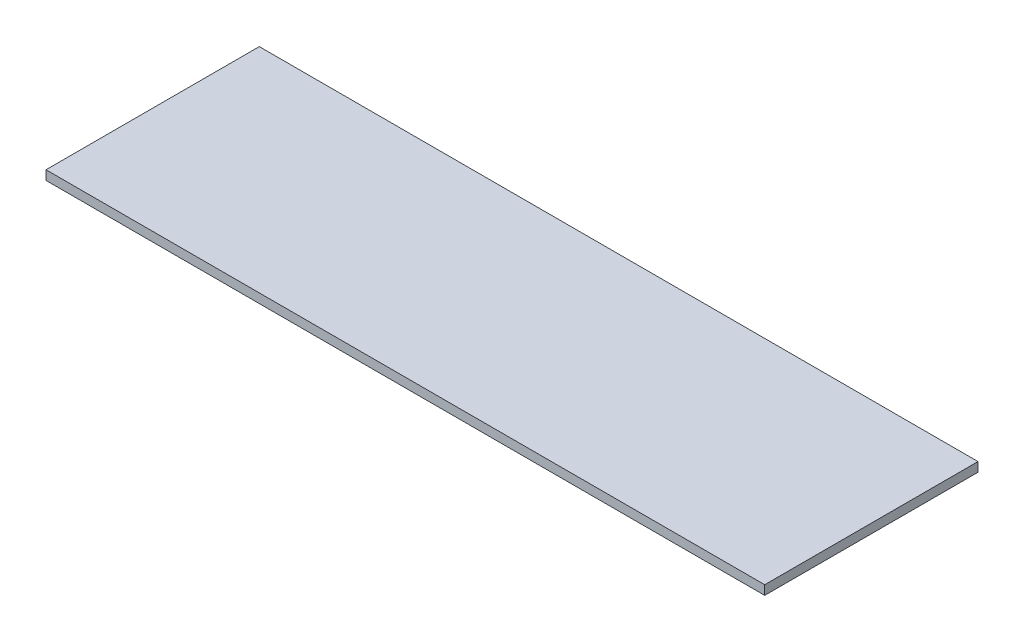
ISO-10303-21;
HEADER;
FILE_DESCRIPTION(('STEP AP214'),'2;1');
FILE_NAME('part.step','',(''),(''),'','','');
FILE_SCHEMA(('AUTOMOTIVE_DESIGN { 1 0 10303 214 1 1 1 1 }'));
ENDSEC;
DATA;
#1=APPLICATION_CONTEXT('core data for automotive mechanical design processes');
#2=APPLICATION_PROTOCOL_DEFINITION('international standard','automotive_design',2000,#1);
#3=PRODUCT_CONTEXT('',#1,'mechanical');
#4=PRODUCT('Part','Part','',(#3));
#5=PRODUCT_RELATED_PRODUCT_CATEGORY('part','',(#4));
#6=PRODUCT_DEFINITION_FORMATION('','',#4);
#7=PRODUCT_DEFINITION_CONTEXT('part definition',#1,'design');
#8=PRODUCT_DEFINITION('design','',#6,#7);
#9=PRODUCT_DEFINITION_SHAPE('','',#8);
#10=(LENGTH_UNIT() NAMED_UNIT(*) SI_UNIT(.MILLI.,.METRE.));
#11=(NAMED_UNIT(*) PLANE_ANGLE_UNIT() SI_UNIT($,.RADIAN.));
#12=(NAMED_UNIT(*) SI_UNIT($,.STERADIAN.) SOLID_ANGLE_UNIT());
#13=UNCERTAINTY_MEASURE_WITH_UNIT(LENGTH_MEASURE(1.E-05),#10,'distance_accuracy_value','');
#14=(GEOMETRIC_REPRESENTATION_CONTEXT(3) GLOBAL_UNCERTAINTY_ASSIGNED_CONTEXT((#13)) GLOBAL_UNIT_ASSIGNED_CONTEXT((#10,
#11,#12)) REPRESENTATION_CONTEXT('',''));
#15=CARTESIAN_POINT('',(0.,0.,0.));
#16=DIRECTION('',(0.,0.,1.));
#17=DIRECTION('',(1.,0.,0.));
#18=AXIS2_PLACEMENT_3D('',#15,#16,#17);
#19=CARTESIAN_POINT('',(77.5,2.,23.));
#20=DIRECTION('',(-1.,0.,0.));
#21=DIRECTION('',(0.,0.,1.));
#22=AXIS2_PLACEMENT_3D('',#19,#20,#21);
#23=PLANE('',#22);
#24=DIRECTION('',(0.,0.,-1.));
#25=VECTOR('',#24,1.);
#26=CARTESIAN_POINT('',(77.5,0.,23.));
#27=LINE('',#26,#25);
#28=CARTESIAN_POINT('',(77.5,0.,23.));
#29=VERTEX_POINT('',#28);
#30=CARTESIAN_POINT('',(77.5,0.,-23.));
#31=VERTEX_POINT('',#30);
#32=EDGE_CURVE('E107',#29,#31,#27,.T.);
#33=ORIENTED_EDGE('',*,*,#32,.T.);
#34=DIRECTION('',(0.,-1.,0.));
#35=VECTOR('',#34,1.);
#36=CARTESIAN_POINT('',(77.5,2.,-23.));
#37=LINE('',#36,#35);
#38=CARTESIAN_POINT('',(77.5,2.,-23.));
#39=VERTEX_POINT('',#38);
#40=EDGE_CURVE('E11',#39,#31,#37,.T.);
#41=ORIENTED_EDGE('',*,*,#40,.F.);
#42=DIRECTION('',(0.,0.,-1.));
#43=VECTOR('',#42,1.);
#44=CARTESIAN_POINT('',(77.5,2.,23.));
#45=LINE('',#44,#43);
#46=CARTESIAN_POINT('',(77.5,2.,23.));
#47=VERTEX_POINT('',#46);
#48=EDGE_CURVE('E91',#47,#39,#45,.T.);
#49=ORIENTED_EDGE('',*,*,#48,.F.);
#50=DIRECTION('',(0.,-1.,0.));
#51=VECTOR('',#50,1.);
#52=CARTESIAN_POINT('',(77.5,2.,23.));
#53=LINE('',#52,#51);
#54=EDGE_CURVE('E103',#47,#29,#53,.T.);
#55=ORIENTED_EDGE('',*,*,#54,.T.);
#56=EDGE_LOOP('',(#33,#41,#49,#55));
#57=FACE_BOUND('',#56,.T.);
#58=ADVANCED_FACE('F39',(#57),#23,.F.);
#59=CARTESIAN_POINT('',(-77.5,2.,-23.));
#60=DIRECTION('',(0.,0.,1.));
#61=DIRECTION('',(1.,0.,0.));
#62=AXIS2_PLACEMENT_3D('',#59,#60,#61);
#63=PLANE('',#62);
#64=DIRECTION('',(-1.,0.,0.));
#65=VECTOR('',#64,1.);
#66=CARTESIAN_POINT('',(-77.5,0.,-23.));
#67=LINE('',#66,#65);
#68=CARTESIAN_POINT('',(-77.5,0.,-23.));
#69=VERTEX_POINT('',#68);
#70=EDGE_CURVE('E96',#31,#69,#67,.T.);
#71=ORIENTED_EDGE('',*,*,#70,.T.);
#72=DIRECTION('',(0.,-1.,0.));
#73=VECTOR('',#72,1.);
#74=CARTESIAN_POINT('',(-77.5,2.,-23.));
#75=LINE('',#74,#73);
#76=CARTESIAN_POINT('',(-77.5,2.,-23.));
#77=VERTEX_POINT('',#76);
#78=EDGE_CURVE('E48',#77,#69,#75,.T.);
#79=ORIENTED_EDGE('',*,*,#78,.F.);
#80=DIRECTION('',(-1.,0.,0.));
#81=VECTOR('',#80,1.);
#82=CARTESIAN_POINT('',(-77.5,2.,-23.));
#83=LINE('',#82,#81);
#84=EDGE_CURVE('E86',#39,#77,#83,.T.);
#85=ORIENTED_EDGE('',*,*,#84,.F.);
#86=ORIENTED_EDGE('',*,*,#40,.T.);
#87=EDGE_LOOP('',(#71,#79,#85,#86));
#88=FACE_BOUND('',#87,.T.);
#89=ADVANCED_FACE('F95',(#88),#63,.F.);
#90=CARTESIAN_POINT('',(-77.5,2.,23.));
#91=DIRECTION('',(1.,0.,0.));
#92=DIRECTION('',(0.,0.,-1.));
#93=AXIS2_PLACEMENT_3D('',#90,#91,#92);
#94=PLANE('',#93);
#95=DIRECTION('',(0.,0.,1.));
#96=VECTOR('',#95,1.);
#97=CARTESIAN_POINT('',(-77.5,0.,23.));
#98=LINE('',#97,#96);
#99=CARTESIAN_POINT('',(-77.5,0.,23.));
#100=VERTEX_POINT('',#99);
#101=EDGE_CURVE('E73',#69,#100,#98,.T.);
#102=ORIENTED_EDGE('',*,*,#101,.T.);
#103=DIRECTION('',(0.,-1.,0.));
#104=VECTOR('',#103,1.);
#105=CARTESIAN_POINT('',(-77.5,2.,23.));
#106=LINE('',#105,#104);
#107=CARTESIAN_POINT('',(-77.5,2.,23.));
#108=VERTEX_POINT('',#107);
#109=EDGE_CURVE('E98',#108,#100,#106,.T.);
#110=ORIENTED_EDGE('',*,*,#109,.F.);
#111=DIRECTION('',(0.,0.,1.));
#112=VECTOR('',#111,1.);
#113=CARTESIAN_POINT('',(-77.5,2.,23.));
#114=LINE('',#113,#112);
#115=EDGE_CURVE('E89',#77,#108,#114,.T.);
#116=ORIENTED_EDGE('',*,*,#115,.F.);
#117=ORIENTED_EDGE('',*,*,#78,.T.);
#118=EDGE_LOOP('',(#102,#110,#116,#117));
#119=FACE_BOUND('',#118,.T.);
#120=ADVANCED_FACE('F99',(#119),#94,.F.);
#121=CARTESIAN_POINT('',(-77.5,2.,23.));
#122=DIRECTION('',(0.,0.,-1.));
#123=DIRECTION('',(-1.,0.,0.));
#124=AXIS2_PLACEMENT_3D('',#121,#122,#123);
#125=PLANE('',#124);
#126=DIRECTION('',(1.,0.,0.));
#127=VECTOR('',#126,1.);
#128=CARTESIAN_POINT('',(-77.5,0.,23.));
#129=LINE('',#128,#127);
#130=EDGE_CURVE('E79',#100,#29,#129,.T.);
#131=ORIENTED_EDGE('',*,*,#130,.T.);
#132=ORIENTED_EDGE('',*,*,#54,.F.);
#133=DIRECTION('',(1.,0.,0.));
#134=VECTOR('',#133,1.);
#135=CARTESIAN_POINT('',(-77.5,2.,23.));
#136=LINE('',#135,#134);
#137=EDGE_CURVE('E56',#108,#47,#136,.T.);
#138=ORIENTED_EDGE('',*,*,#137,.F.);
#139=ORIENTED_EDGE('',*,*,#109,.T.);
#140=EDGE_LOOP('',(#131,#132,#138,#139));
#141=FACE_BOUND('',#140,.T.);
#142=ADVANCED_FACE('F120',(#141),#125,.F.);
#143=CARTESIAN_POINT('',(0.,2.,0.));
#144=DIRECTION('',(0.,-1.,0.));
#145=DIRECTION('',(0.,0.,-1.));
#146=AXIS2_PLACEMENT_3D('',#143,#144,#145);
#147=PLANE('',#146);
#148=ORIENTED_EDGE('',*,*,#48,.T.);
#149=ORIENTED_EDGE('',*,*,#84,.T.);
#150=ORIENTED_EDGE('',*,*,#115,.T.);
#151=ORIENTED_EDGE('',*,*,#137,.T.);
#152=EDGE_LOOP('',(#148,#149,#150,#151));
#153=FACE_BOUND('',#152,.T.);
#154=ADVANCED_FACE('F87',(#153),#147,.F.);
#155=CARTESIAN_POINT('',(0.,0.,0.));
#156=DIRECTION('',(0.,-1.,0.));
#157=DIRECTION('',(0.,0.,-1.));
#158=AXIS2_PLACEMENT_3D('',#155,#156,#157);
#159=PLANE('',#158);
#160=ORIENTED_EDGE('',*,*,#32,.F.);
#161=ORIENTED_EDGE('',*,*,#130,.F.);
#162=ORIENTED_EDGE('',*,*,#101,.F.);
#163=ORIENTED_EDGE('',*,*,#70,.F.);
#164=EDGE_LOOP('',(#160,#161,#162,#163));
#165=FACE_BOUND('',#164,.T.);
#166=ADVANCED_FACE('F123',(#165),#159,.T.);
#167=CLOSED_SHELL('',(#58,#89,#120,#142,#154,#166));
#168=MANIFOLD_SOLID_BREP('B2',#167);
#169=ADVANCED_BREP_SHAPE_REPRESENTATION('',(#18,#168),#14);
#170=SHAPE_DEFINITION_REPRESENTATION(#9,#169);
ENDSEC;
END-ISO-10303-21;
